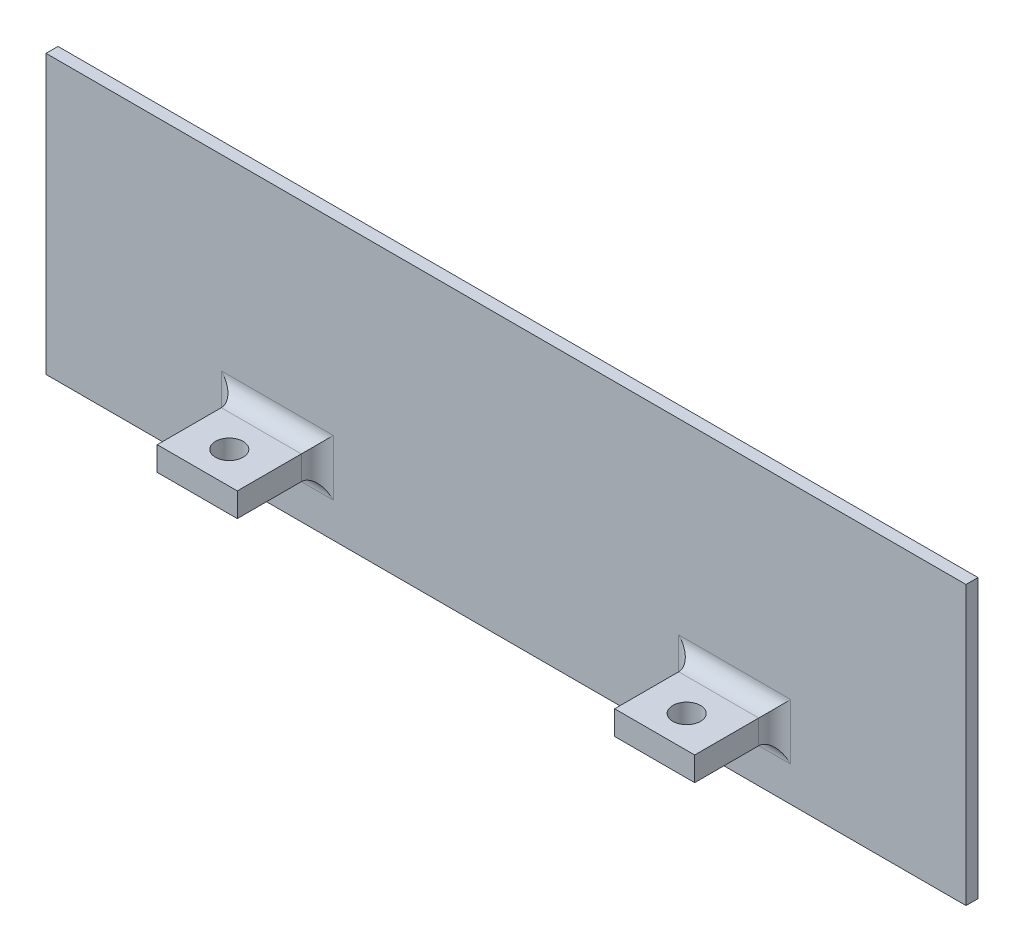
ISO-10303-21;
HEADER;
FILE_DESCRIPTION(('STEP AP214'),'2;1');
FILE_NAME('part.step','',(''),(''),'','','');
FILE_SCHEMA(('AUTOMOTIVE_DESIGN { 1 0 10303 214 1 1 1 1 }'));
ENDSEC;
DATA;
#1=APPLICATION_CONTEXT('core data for automotive mechanical design processes');
#2=APPLICATION_PROTOCOL_DEFINITION('international standard','automotive_design',2000,#1);
#3=PRODUCT_CONTEXT('',#1,'mechanical');
#4=PRODUCT('Part','Part','',(#3));
#5=PRODUCT_RELATED_PRODUCT_CATEGORY('part','',(#4));
#6=PRODUCT_DEFINITION_FORMATION('','',#4);
#7=PRODUCT_DEFINITION_CONTEXT('part definition',#1,'design');
#8=PRODUCT_DEFINITION('design','',#6,#7);
#9=PRODUCT_DEFINITION_SHAPE('','',#8);
#10=(LENGTH_UNIT() NAMED_UNIT(*) SI_UNIT(.MILLI.,.METRE.));
#11=(NAMED_UNIT(*) PLANE_ANGLE_UNIT() SI_UNIT($,.RADIAN.));
#12=(NAMED_UNIT(*) SI_UNIT($,.STERADIAN.) SOLID_ANGLE_UNIT());
#13=UNCERTAINTY_MEASURE_WITH_UNIT(LENGTH_MEASURE(1.E-05),#10,'distance_accuracy_value','');
#14=(GEOMETRIC_REPRESENTATION_CONTEXT(3) GLOBAL_UNCERTAINTY_ASSIGNED_CONTEXT((#13)) GLOBAL_UNIT_ASSIGNED_CONTEXT((#10,
#11,#12)) REPRESENTATION_CONTEXT('',''));
#15=CARTESIAN_POINT('',(0.,0.,0.));
#16=DIRECTION('',(0.,0.,1.));
#17=DIRECTION('',(1.,0.,0.));
#18=AXIS2_PLACEMENT_3D('',#15,#16,#17);
#19=CARTESIAN_POINT('',(0.,0.,1.5));
#20=DIRECTION('',(0.,0.,-1.));
#21=DIRECTION('',(-1.,0.,0.));
#22=AXIS2_PLACEMENT_3D('',#19,#20,#21);
#23=PLANE('',#22);
#24=DIRECTION('',(1.,0.,0.));
#25=VECTOR('',#24,1.);
#26=CARTESIAN_POINT('',(23.575,-8.64111728192778,1.5));
#27=LINE('',#26,#25);
#28=CARTESIAN_POINT('',(35.575,-8.64111728192778,1.5));
#29=VERTEX_POINT('',#28);
#30=CARTESIAN_POINT('',(21.575,-8.64111728192778,1.5));
#31=VERTEX_POINT('',#30);
#32=EDGE_CURVE('E244',#29,#31,#27,.F.);
#33=ORIENTED_EDGE('',*,*,#32,.T.);
#34=DIRECTION('',(0.,-1.,0.));
#35=VECTOR('',#34,1.);
#36=CARTESIAN_POINT('',(21.575,-3.64111728192778,1.5));
#37=LINE('',#36,#35);
#38=CARTESIAN_POINT('',(21.575,-1.64111728192778,1.5));
#39=VERTEX_POINT('',#38);
#40=EDGE_CURVE('E250',#31,#39,#37,.F.);
#41=ORIENTED_EDGE('',*,*,#40,.T.);
#42=DIRECTION('',(-1.,0.,0.));
#43=VECTOR('',#42,1.);
#44=CARTESIAN_POINT('',(33.575,-1.64111728192778,1.5));
#45=LINE('',#44,#43);
#46=CARTESIAN_POINT('',(35.575,-1.64111728192778,1.5));
#47=VERTEX_POINT('',#46);
#48=EDGE_CURVE('E248',#39,#47,#45,.F.);
#49=ORIENTED_EDGE('',*,*,#48,.T.);
#50=DIRECTION('',(0.,1.,0.));
#51=VECTOR('',#50,1.);
#52=CARTESIAN_POINT('',(35.575,-6.64111728192778,1.5));
#53=LINE('',#52,#51);
#54=EDGE_CURVE('E246',#47,#29,#53,.F.);
#55=ORIENTED_EDGE('',*,*,#54,.T.);
#56=EDGE_LOOP('',(#33,#41,#49,#55));
#57=FACE_BOUND('',#56,.T.);
#58=DIRECTION('',(-1.,0.,0.));
#59=VECTOR('',#58,1.);
#60=CARTESIAN_POINT('',(-23.575,-1.64111728192778,1.5));
#61=LINE('',#60,#59);
#62=CARTESIAN_POINT('',(-35.575,-1.64111728192778,1.5));
#63=VERTEX_POINT('',#62);
#64=CARTESIAN_POINT('',(-21.575,-1.64111728192778,1.5));
#65=VERTEX_POINT('',#64);
#66=EDGE_CURVE('E239',#63,#65,#61,.F.);
#67=ORIENTED_EDGE('',*,*,#66,.T.);
#68=DIRECTION('',(0.,1.,0.));
#69=VECTOR('',#68,1.);
#70=CARTESIAN_POINT('',(-21.575,-6.64111728192778,1.5));
#71=LINE('',#70,#69);
#72=CARTESIAN_POINT('',(-21.575,-8.64111728192778,1.5));
#73=VERTEX_POINT('',#72);
#74=EDGE_CURVE('E241',#65,#73,#71,.F.);
#75=ORIENTED_EDGE('',*,*,#74,.T.);
#76=DIRECTION('',(1.,0.,0.));
#77=VECTOR('',#76,1.);
#78=CARTESIAN_POINT('',(-33.575,-8.64111728192778,1.5));
#79=LINE('',#78,#77);
#80=CARTESIAN_POINT('',(-35.575,-8.64111728192778,1.5));
#81=VERTEX_POINT('',#80);
#82=EDGE_CURVE('E235',#73,#81,#79,.F.);
#83=ORIENTED_EDGE('',*,*,#82,.T.);
#84=DIRECTION('',(0.,-1.,0.));
#85=VECTOR('',#84,1.);
#86=CARTESIAN_POINT('',(-35.575,-3.64111728192778,1.5));
#87=LINE('',#86,#85);
#88=EDGE_CURVE('E237',#81,#63,#87,.F.);
#89=ORIENTED_EDGE('',*,*,#88,.T.);
#90=EDGE_LOOP('',(#67,#75,#83,#89));
#91=FACE_BOUND('',#90,.T.);
#92=DIRECTION('',(0.,1.,0.));
#93=VECTOR('',#92,1.);
#94=CARTESIAN_POINT('',(57.4750000000003,-12.9911172819278,1.5));
#95=LINE('',#94,#93);
#96=CARTESIAN_POINT('',(57.4750000000003,-12.9911172819278,1.5));
#97=VERTEX_POINT('',#96);
#98=CARTESIAN_POINT('',(57.4749999999997,21.7588827180722,1.5));
#99=VERTEX_POINT('',#98);
#100=EDGE_CURVE('E203',#97,#99,#95,.T.);
#101=ORIENTED_EDGE('',*,*,#100,.T.);
#102=DIRECTION('',(-1.,0.,0.));
#103=VECTOR('',#102,1.);
#104=CARTESIAN_POINT('',(-57.4750000000003,21.7588827180722,1.5));
#105=LINE('',#104,#103);
#106=CARTESIAN_POINT('',(-57.4750000000003,21.7588827180722,1.5));
#107=VERTEX_POINT('',#106);
#108=EDGE_CURVE('E206',#99,#107,#105,.T.);
#109=ORIENTED_EDGE('',*,*,#108,.T.);
#110=DIRECTION('',(0.,-1.,0.));
#111=VECTOR('',#110,1.);
#112=CARTESIAN_POINT('',(-57.4750000000003,-12.9911172819278,1.5));
#113=LINE('',#112,#111);
#114=CARTESIAN_POINT('',(-57.4750000000003,-12.9911172819278,1.5));
#115=VERTEX_POINT('',#114);
#116=EDGE_CURVE('E209',#107,#115,#113,.T.);
#117=ORIENTED_EDGE('',*,*,#116,.T.);
#118=DIRECTION('',(1.,0.,0.));
#119=VECTOR('',#118,1.);
#120=CARTESIAN_POINT('',(-57.4750000000003,-12.9911172819278,1.5));
#121=LINE('',#120,#119);
#122=EDGE_CURVE('E211',#115,#97,#121,.T.);
#123=ORIENTED_EDGE('',*,*,#122,.T.);
#124=EDGE_LOOP('',(#101,#109,#117,#123));
#125=FACE_BOUND('',#124,.T.);
#126=ADVANCED_FACE('F37',(#57,#91,#125),#23,.F.);
#127=CARTESIAN_POINT('',(57.4750000000003,-12.9911172819278,1.5));
#128=DIRECTION('',(-1.,0.,0.));
#129=DIRECTION('',(0.,-1.,0.));
#130=AXIS2_PLACEMENT_3D('',#127,#128,#129);
#131=PLANE('',#130);
#132=DIRECTION('',(0.,1.,0.));
#133=VECTOR('',#132,1.);
#134=CARTESIAN_POINT('',(57.4750000000003,-12.9911172819278,0.));
#135=LINE('',#134,#133);
#136=CARTESIAN_POINT('',(57.4750000000003,-12.9911172819278,0.));
#137=VERTEX_POINT('',#136);
#138=CARTESIAN_POINT('',(57.4749999999997,21.7588827180722,0.));
#139=VERTEX_POINT('',#138);
#140=EDGE_CURVE('E202',#137,#139,#135,.T.);
#141=ORIENTED_EDGE('',*,*,#140,.T.);
#142=DIRECTION('',(0.,0.,-1.));
#143=VECTOR('',#142,1.);
#144=CARTESIAN_POINT('',(57.4749999999997,21.7588827180722,1.5));
#145=LINE('',#144,#143);
#146=EDGE_CURVE('E229',#99,#139,#145,.T.);
#147=ORIENTED_EDGE('',*,*,#146,.F.);
#148=ORIENTED_EDGE('',*,*,#100,.F.);
#149=DIRECTION('',(0.,0.,-1.));
#150=VECTOR('',#149,1.);
#151=CARTESIAN_POINT('',(57.4750000000003,-12.9911172819278,1.5));
#152=LINE('',#151,#150);
#153=EDGE_CURVE('E213',#97,#137,#152,.T.);
#154=ORIENTED_EDGE('',*,*,#153,.T.);
#155=EDGE_LOOP('',(#141,#147,#148,#154));
#156=FACE_BOUND('',#155,.T.);
#157=ADVANCED_FACE('F317',(#156),#131,.F.);
#158=CARTESIAN_POINT('',(-57.4750000000003,21.7588827180722,1.5));
#159=DIRECTION('',(0.,-1.,0.));
#160=DIRECTION('',(0.,0.,-1.));
#161=AXIS2_PLACEMENT_3D('',#158,#159,#160);
#162=PLANE('',#161);
#163=DIRECTION('',(-1.,0.,0.));
#164=VECTOR('',#163,1.);
#165=CARTESIAN_POINT('',(-57.4750000000003,21.7588827180722,0.));
#166=LINE('',#165,#164);
#167=CARTESIAN_POINT('',(-57.4750000000003,21.7588827180722,0.));
#168=VERTEX_POINT('',#167);
#169=EDGE_CURVE('E216',#139,#168,#166,.T.);
#170=ORIENTED_EDGE('',*,*,#169,.T.);
#171=DIRECTION('',(0.,0.,-1.));
#172=VECTOR('',#171,1.);
#173=CARTESIAN_POINT('',(-57.4750000000003,21.7588827180722,1.5));
#174=LINE('',#173,#172);
#175=EDGE_CURVE('E226',#107,#168,#174,.T.);
#176=ORIENTED_EDGE('',*,*,#175,.F.);
#177=ORIENTED_EDGE('',*,*,#108,.F.);
#178=ORIENTED_EDGE('',*,*,#146,.T.);
#179=EDGE_LOOP('',(#170,#176,#177,#178));
#180=FACE_BOUND('',#179,.T.);
#181=ADVANCED_FACE('F322',(#180),#162,.F.);
#182=CARTESIAN_POINT('',(-57.4750000000003,-12.9911172819278,1.5));
#183=DIRECTION('',(1.,0.,0.));
#184=DIRECTION('',(0.,0.,-1.));
#185=AXIS2_PLACEMENT_3D('',#182,#183,#184);
#186=PLANE('',#185);
#187=DIRECTION('',(0.,-1.,0.));
#188=VECTOR('',#187,1.);
#189=CARTESIAN_POINT('',(-57.4750000000003,-12.9911172819278,0.));
#190=LINE('',#189,#188);
#191=CARTESIAN_POINT('',(-57.4750000000003,-12.9911172819278,0.));
#192=VERTEX_POINT('',#191);
#193=EDGE_CURVE('E218',#168,#192,#190,.T.);
#194=ORIENTED_EDGE('',*,*,#193,.T.);
#195=DIRECTION('',(0.,0.,-1.));
#196=VECTOR('',#195,1.);
#197=CARTESIAN_POINT('',(-57.4750000000003,-12.9911172819278,1.5));
#198=LINE('',#197,#196);
#199=EDGE_CURVE('E223',#115,#192,#198,.T.);
#200=ORIENTED_EDGE('',*,*,#199,.F.);
#201=ORIENTED_EDGE('',*,*,#116,.F.);
#202=ORIENTED_EDGE('',*,*,#175,.T.);
#203=EDGE_LOOP('',(#194,#200,#201,#202));
#204=FACE_BOUND('',#203,.T.);
#205=ADVANCED_FACE('F336',(#204),#186,.F.);
#206=CARTESIAN_POINT('',(-57.4750000000003,-12.9911172819278,1.5));
#207=DIRECTION('',(0.,1.,0.));
#208=DIRECTION('',(0.,0.,1.));
#209=AXIS2_PLACEMENT_3D('',#206,#207,#208);
#210=PLANE('',#209);
#211=DIRECTION('',(1.,0.,0.));
#212=VECTOR('',#211,1.);
#213=CARTESIAN_POINT('',(-57.4750000000003,-12.9911172819278,0.));
#214=LINE('',#213,#212);
#215=EDGE_CURVE('E207',#192,#137,#214,.T.);
#216=ORIENTED_EDGE('',*,*,#215,.T.);
#217=ORIENTED_EDGE('',*,*,#153,.F.);
#218=ORIENTED_EDGE('',*,*,#122,.F.);
#219=ORIENTED_EDGE('',*,*,#199,.T.);
#220=EDGE_LOOP('',(#216,#217,#218,#219));
#221=FACE_BOUND('',#220,.T.);
#222=ADVANCED_FACE('F332',(#221),#210,.F.);
#223=CARTESIAN_POINT('',(0.,0.,0.));
#224=DIRECTION('',(0.,0.,-1.));
#225=DIRECTION('',(-1.,0.,0.));
#226=AXIS2_PLACEMENT_3D('',#223,#224,#225);
#227=PLANE('',#226);
#228=ORIENTED_EDGE('',*,*,#140,.F.);
#229=ORIENTED_EDGE('',*,*,#215,.F.);
#230=ORIENTED_EDGE('',*,*,#193,.F.);
#231=ORIENTED_EDGE('',*,*,#169,.F.);
#232=EDGE_LOOP('',(#228,#229,#230,#231));
#233=FACE_BOUND('',#232,.T.);
#234=ADVANCED_FACE('F329',(#233),#227,.T.);
#235=CARTESIAN_POINT('',(-33.575,-3.64111728192778,11.5));
#236=DIRECTION('',(1.,0.,0.));
#237=DIRECTION('',(0.,0.,-1.));
#238=AXIS2_PLACEMENT_3D('',#235,#236,#237);
#239=PLANE('',#238);
#240=DIRECTION('',(0.,0.,-1.));
#241=VECTOR('',#240,1.);
#242=CARTESIAN_POINT('',(-33.575,-3.64111728192778,11.5));
#243=LINE('',#242,#241);
#244=CARTESIAN_POINT('',(-33.575,-3.64111728192778,11.5));
#245=VERTEX_POINT('',#244);
#246=CARTESIAN_POINT('',(-33.575,-3.64111728192778,3.5));
#247=VERTEX_POINT('',#246);
#248=EDGE_CURVE('E192',#245,#247,#243,.T.);
#249=ORIENTED_EDGE('',*,*,#248,.T.);
#250=DIRECTION('',(0.,-1.,0.));
#251=VECTOR('',#250,1.);
#252=CARTESIAN_POINT('',(-33.575,-6.64111728192778,3.5));
#253=LINE('',#252,#251);
#254=CARTESIAN_POINT('',(-33.575,-6.64111728192778,3.5));
#255=VERTEX_POINT('',#254);
#256=EDGE_CURVE('E46',#247,#255,#253,.T.);
#257=ORIENTED_EDGE('',*,*,#256,.T.);
#258=DIRECTION('',(0.,0.,-1.));
#259=VECTOR('',#258,1.);
#260=CARTESIAN_POINT('',(-33.575,-6.64111728192778,11.5));
#261=LINE('',#260,#259);
#262=CARTESIAN_POINT('',(-33.575,-6.64111728192778,11.5));
#263=VERTEX_POINT('',#262);
#264=EDGE_CURVE('E200',#263,#255,#261,.T.);
#265=ORIENTED_EDGE('',*,*,#264,.F.);
#266=DIRECTION('',(0.,-1.,0.));
#267=VECTOR('',#266,1.);
#268=CARTESIAN_POINT('',(-33.575,-3.64111728192778,11.5));
#269=LINE('',#268,#267);
#270=EDGE_CURVE('E178',#245,#263,#269,.T.);
#271=ORIENTED_EDGE('',*,*,#270,.F.);
#272=EDGE_LOOP('',(#249,#257,#265,#271));
#273=FACE_BOUND('',#272,.T.);
#274=ADVANCED_FACE('F327',(#273),#239,.F.);
#275=CARTESIAN_POINT('',(-33.575,-6.64111728192778,11.5));
#276=DIRECTION('',(0.,1.,0.));
#277=DIRECTION('',(0.,0.,1.));
#278=AXIS2_PLACEMENT_3D('',#275,#276,#277);
#279=PLANE('',#278);
#280=CARTESIAN_POINT('',(-28.575,-6.64111728192778,7.5));
#281=DIRECTION('',(0.,1.,0.));
#282=DIRECTION('',(0.,0.,1.));
#283=AXIS2_PLACEMENT_3D('',#280,#281,#282);
#284=CIRCLE('',#283,1.7272);
#285=CARTESIAN_POINT('',(-28.575,-6.64111728192778,9.2272));
#286=VERTEX_POINT('',#285);
#287=EDGE_CURVE('E629',#286,#286,#284,.T.);
#288=ORIENTED_EDGE('',*,*,#287,.T.);
#289=EDGE_LOOP('',(#288));
#290=FACE_BOUND('',#289,.T.);
#291=ORIENTED_EDGE('',*,*,#264,.T.);
#292=DIRECTION('',(1.,0.,0.));
#293=VECTOR('',#292,1.);
#294=CARTESIAN_POINT('',(-23.575,-6.64111728192778,3.5));
#295=LINE('',#294,#293);
#296=CARTESIAN_POINT('',(-23.575,-6.64111728192778,3.5));
#297=VERTEX_POINT('',#296);
#298=EDGE_CURVE('E11',#255,#297,#295,.T.);
#299=ORIENTED_EDGE('',*,*,#298,.T.);
#300=DIRECTION('',(0.,0.,-1.));
#301=VECTOR('',#300,1.);
#302=CARTESIAN_POINT('',(-23.575,-6.64111728192778,11.5));
#303=LINE('',#302,#301);
#304=CARTESIAN_POINT('',(-23.575,-6.64111728192778,11.5));
#305=VERTEX_POINT('',#304);
#306=EDGE_CURVE('E197',#305,#297,#303,.T.);
#307=ORIENTED_EDGE('',*,*,#306,.F.);
#308=DIRECTION('',(1.,0.,0.));
#309=VECTOR('',#308,1.);
#310=CARTESIAN_POINT('',(-33.575,-6.64111728192778,11.5));
#311=LINE('',#310,#309);
#312=EDGE_CURVE('E182',#263,#305,#311,.T.);
#313=ORIENTED_EDGE('',*,*,#312,.F.);
#314=EDGE_LOOP('',(#291,#299,#307,#313));
#315=FACE_BOUND('',#314,.T.);
#316=ADVANCED_FACE('F512',(#290,#315),#279,.F.);
#317=CARTESIAN_POINT('',(-23.575,-3.64111728192778,11.5));
#318=DIRECTION('',(-1.,0.,0.));
#319=DIRECTION('',(0.,0.,1.));
#320=AXIS2_PLACEMENT_3D('',#317,#318,#319);
#321=PLANE('',#320);
#322=ORIENTED_EDGE('',*,*,#306,.T.);
#323=DIRECTION('',(0.,1.,0.));
#324=VECTOR('',#323,1.);
#325=CARTESIAN_POINT('',(-23.575,-3.64111728192778,3.5));
#326=LINE('',#325,#324);
#327=CARTESIAN_POINT('',(-23.575,-3.64111728192778,3.5));
#328=VERTEX_POINT('',#327);
#329=EDGE_CURVE('E232',#297,#328,#326,.T.);
#330=ORIENTED_EDGE('',*,*,#329,.T.);
#331=DIRECTION('',(0.,0.,-1.));
#332=VECTOR('',#331,1.);
#333=CARTESIAN_POINT('',(-23.575,-3.64111728192778,11.5));
#334=LINE('',#333,#332);
#335=CARTESIAN_POINT('',(-23.575,-3.64111728192778,11.5));
#336=VERTEX_POINT('',#335);
#337=EDGE_CURVE('E194',#336,#328,#334,.T.);
#338=ORIENTED_EDGE('',*,*,#337,.F.);
#339=DIRECTION('',(0.,1.,0.));
#340=VECTOR('',#339,1.);
#341=CARTESIAN_POINT('',(-23.575,-3.64111728192778,11.5));
#342=LINE('',#341,#340);
#343=EDGE_CURVE('E188',#305,#336,#342,.T.);
#344=ORIENTED_EDGE('',*,*,#343,.F.);
#345=EDGE_LOOP('',(#322,#330,#338,#344));
#346=FACE_BOUND('',#345,.T.);
#347=ADVANCED_FACE('F503',(#346),#321,.F.);
#348=CARTESIAN_POINT('',(-33.575,-3.64111728192778,11.5));
#349=DIRECTION('',(0.,-1.,0.));
#350=DIRECTION('',(0.,0.,-1.));
#351=AXIS2_PLACEMENT_3D('',#348,#349,#350);
#352=PLANE('',#351);
#353=CARTESIAN_POINT('',(-28.575,-3.64111728192778,7.5));
#354=DIRECTION('',(0.,1.,0.));
#355=DIRECTION('',(0.,0.,1.));
#356=AXIS2_PLACEMENT_3D('',#353,#354,#355);
#357=CIRCLE('',#356,1.7272);
#358=CARTESIAN_POINT('',(-28.575,-3.64111728192778,9.2272));
#359=VERTEX_POINT('',#358);
#360=EDGE_CURVE('E632',#359,#359,#357,.T.);
#361=ORIENTED_EDGE('',*,*,#360,.F.);
#362=EDGE_LOOP('',(#361));
#363=FACE_BOUND('',#362,.T.);
#364=ORIENTED_EDGE('',*,*,#337,.T.);
#365=DIRECTION('',(-1.,0.,0.));
#366=VECTOR('',#365,1.);
#367=CARTESIAN_POINT('',(-33.575,-3.64111728192778,3.5));
#368=LINE('',#367,#366);
#369=EDGE_CURVE('E253',#328,#247,#368,.T.);
#370=ORIENTED_EDGE('',*,*,#369,.T.);
#371=ORIENTED_EDGE('',*,*,#248,.F.);
#372=DIRECTION('',(-1.,0.,0.));
#373=VECTOR('',#372,1.);
#374=CARTESIAN_POINT('',(-33.575,-3.64111728192778,11.5));
#375=LINE('',#374,#373);
#376=EDGE_CURVE('E190',#336,#245,#375,.T.);
#377=ORIENTED_EDGE('',*,*,#376,.F.);
#378=EDGE_LOOP('',(#364,#370,#371,#377));
#379=FACE_BOUND('',#378,.T.);
#380=ADVANCED_FACE('F494',(#363,#379),#352,.F.);
#381=CARTESIAN_POINT('',(0.,0.,11.5));
#382=DIRECTION('',(0.,0.,1.));
#383=DIRECTION('',(1.,0.,0.));
#384=AXIS2_PLACEMENT_3D('',#381,#382,#383);
#385=PLANE('',#384);
#386=ORIENTED_EDGE('',*,*,#270,.T.);
#387=ORIENTED_EDGE('',*,*,#312,.T.);
#388=ORIENTED_EDGE('',*,*,#343,.T.);
#389=ORIENTED_EDGE('',*,*,#376,.T.);
#390=EDGE_LOOP('',(#386,#387,#388,#389));
#391=FACE_BOUND('',#390,.T.);
#392=ADVANCED_FACE('F485',(#391),#385,.T.);
#393=CARTESIAN_POINT('',(23.575,-3.64111728192778,11.5));
#394=DIRECTION('',(1.,0.,0.));
#395=DIRECTION('',(0.,1.,0.));
#396=AXIS2_PLACEMENT_3D('',#393,#394,#395);
#397=PLANE('',#396);
#398=DIRECTION('',(0.,0.,-1.));
#399=VECTOR('',#398,1.);
#400=CARTESIAN_POINT('',(23.575,-3.64111728192778,11.5));
#401=LINE('',#400,#399);
#402=CARTESIAN_POINT('',(23.575,-3.64111728192778,11.5));
#403=VERTEX_POINT('',#402);
#404=CARTESIAN_POINT('',(23.575,-3.64111728192778,3.5));
#405=VERTEX_POINT('',#404);
#406=EDGE_CURVE('E165',#403,#405,#401,.T.);
#407=ORIENTED_EDGE('',*,*,#406,.T.);
#408=DIRECTION('',(0.,-1.,0.));
#409=VECTOR('',#408,1.);
#410=CARTESIAN_POINT('',(23.575,-6.64111728192778,3.5));
#411=LINE('',#410,#409);
#412=CARTESIAN_POINT('',(23.575,-6.64111728192778,3.5));
#413=VERTEX_POINT('',#412);
#414=EDGE_CURVE('E255',#405,#413,#411,.T.);
#415=ORIENTED_EDGE('',*,*,#414,.T.);
#416=DIRECTION('',(0.,0.,-1.));
#417=VECTOR('',#416,1.);
#418=CARTESIAN_POINT('',(23.575,-6.64111728192778,11.5));
#419=LINE('',#418,#417);
#420=CARTESIAN_POINT('',(23.575,-6.64111728192778,11.5));
#421=VERTEX_POINT('',#420);
#422=EDGE_CURVE('E177',#421,#413,#419,.T.);
#423=ORIENTED_EDGE('',*,*,#422,.F.);
#424=DIRECTION('',(0.,-1.,0.));
#425=VECTOR('',#424,1.);
#426=CARTESIAN_POINT('',(23.575,-3.64111728192778,11.5));
#427=LINE('',#426,#425);
#428=EDGE_CURVE('E158',#403,#421,#427,.T.);
#429=ORIENTED_EDGE('',*,*,#428,.F.);
#430=EDGE_LOOP('',(#407,#415,#423,#429));
#431=FACE_BOUND('',#430,.T.);
#432=ADVANCED_FACE('F176',(#431),#397,.F.);
#433=CARTESIAN_POINT('',(23.575,-6.64111728192778,11.5));
#434=DIRECTION('',(0.,1.,0.));
#435=DIRECTION('',(0.,0.,1.));
#436=AXIS2_PLACEMENT_3D('',#433,#434,#435);
#437=PLANE('',#436);
#438=CARTESIAN_POINT('',(28.575,-6.64111728192778,7.5));
#439=DIRECTION('',(0.,1.,0.));
#440=DIRECTION('',(0.,0.,1.));
#441=AXIS2_PLACEMENT_3D('',#438,#439,#440);
#442=CIRCLE('',#441,1.7272);
#443=CARTESIAN_POINT('',(28.575,-6.64111728192778,9.2272));
#444=VERTEX_POINT('',#443);
#445=EDGE_CURVE('E275',#444,#444,#442,.T.);
#446=ORIENTED_EDGE('',*,*,#445,.T.);
#447=EDGE_LOOP('',(#446));
#448=FACE_BOUND('',#447,.T.);
#449=ORIENTED_EDGE('',*,*,#422,.T.);
#450=DIRECTION('',(1.,0.,0.));
#451=VECTOR('',#450,1.);
#452=CARTESIAN_POINT('',(33.575,-6.64111728192778,3.5));
#453=LINE('',#452,#451);
#454=CARTESIAN_POINT('',(33.575,-6.64111728192778,3.5));
#455=VERTEX_POINT('',#454);
#456=EDGE_CURVE('E61',#413,#455,#453,.T.);
#457=ORIENTED_EDGE('',*,*,#456,.T.);
#458=DIRECTION('',(0.,0.,-1.));
#459=VECTOR('',#458,1.);
#460=CARTESIAN_POINT('',(33.575,-6.64111728192778,11.5));
#461=LINE('',#460,#459);
#462=CARTESIAN_POINT('',(33.575,-6.64111728192778,11.5));
#463=VERTEX_POINT('',#462);
#464=EDGE_CURVE('E298',#463,#455,#461,.T.);
#465=ORIENTED_EDGE('',*,*,#464,.F.);
#466=DIRECTION('',(1.,0.,0.));
#467=VECTOR('',#466,1.);
#468=CARTESIAN_POINT('',(23.575,-6.64111728192778,11.5));
#469=LINE('',#468,#467);
#470=EDGE_CURVE('E179',#421,#463,#469,.T.);
#471=ORIENTED_EDGE('',*,*,#470,.F.);
#472=EDGE_LOOP('',(#449,#457,#465,#471));
#473=FACE_BOUND('',#472,.T.);
#474=ADVANCED_FACE('F297',(#448,#473),#437,.F.);
#475=CARTESIAN_POINT('',(33.575,-3.64111728192778,11.5));
#476=DIRECTION('',(-1.,0.,0.));
#477=DIRECTION('',(0.,0.,1.));
#478=AXIS2_PLACEMENT_3D('',#475,#476,#477);
#479=PLANE('',#478);
#480=ORIENTED_EDGE('',*,*,#464,.T.);
#481=DIRECTION('',(0.,1.,0.));
#482=VECTOR('',#481,1.);
#483=CARTESIAN_POINT('',(33.575,-3.64111728192778,3.5));
#484=LINE('',#483,#482);
#485=CARTESIAN_POINT('',(33.575,-3.64111728192778,3.5));
#486=VERTEX_POINT('',#485);
#487=EDGE_CURVE('E258',#455,#486,#484,.T.);
#488=ORIENTED_EDGE('',*,*,#487,.T.);
#489=DIRECTION('',(0.,0.,-1.));
#490=VECTOR('',#489,1.);
#491=CARTESIAN_POINT('',(33.575,-3.64111728192778,11.5));
#492=LINE('',#491,#490);
#493=CARTESIAN_POINT('',(33.575,-3.64111728192778,11.5));
#494=VERTEX_POINT('',#493);
#495=EDGE_CURVE('E174',#494,#486,#492,.T.);
#496=ORIENTED_EDGE('',*,*,#495,.F.);
#497=DIRECTION('',(0.,1.,0.));
#498=VECTOR('',#497,1.);
#499=CARTESIAN_POINT('',(33.575,-3.64111728192778,11.5));
#500=LINE('',#499,#498);
#501=EDGE_CURVE('E161',#463,#494,#500,.T.);
#502=ORIENTED_EDGE('',*,*,#501,.F.);
#503=EDGE_LOOP('',(#480,#488,#496,#502));
#504=FACE_BOUND('',#503,.T.);
#505=ADVANCED_FACE('F305',(#504),#479,.F.);
#506=CARTESIAN_POINT('',(23.575,-3.64111728192778,11.5));
#507=DIRECTION('',(0.,-1.,0.));
#508=DIRECTION('',(0.,0.,-1.));
#509=AXIS2_PLACEMENT_3D('',#506,#507,#508);
#510=PLANE('',#509);
#511=CARTESIAN_POINT('',(28.575,-3.64111728192778,7.5));
#512=DIRECTION('',(0.,1.,0.));
#513=DIRECTION('',(0.,0.,1.));
#514=AXIS2_PLACEMENT_3D('',#511,#512,#513);
#515=CIRCLE('',#514,1.7272);
#516=CARTESIAN_POINT('',(28.575,-3.64111728192778,9.2272));
#517=VERTEX_POINT('',#516);
#518=EDGE_CURVE('E631',#517,#517,#515,.T.);
#519=ORIENTED_EDGE('',*,*,#518,.F.);
#520=EDGE_LOOP('',(#519));
#521=FACE_BOUND('',#520,.T.);
#522=ORIENTED_EDGE('',*,*,#495,.T.);
#523=DIRECTION('',(-1.,0.,0.));
#524=VECTOR('',#523,1.);
#525=CARTESIAN_POINT('',(23.575,-3.64111728192778,3.5));
#526=LINE('',#525,#524);
#527=EDGE_CURVE('E170',#486,#405,#526,.T.);
#528=ORIENTED_EDGE('',*,*,#527,.T.);
#529=ORIENTED_EDGE('',*,*,#406,.F.);
#530=DIRECTION('',(-1.,0.,0.));
#531=VECTOR('',#530,1.);
#532=CARTESIAN_POINT('',(23.575,-3.64111728192778,11.5));
#533=LINE('',#532,#531);
#534=EDGE_CURVE('E154',#494,#403,#533,.T.);
#535=ORIENTED_EDGE('',*,*,#534,.F.);
#536=EDGE_LOOP('',(#522,#528,#529,#535));
#537=FACE_BOUND('',#536,.T.);
#538=ADVANCED_FACE('F168',(#521,#537),#510,.F.);
#539=CARTESIAN_POINT('',(0.,0.,11.5));
#540=DIRECTION('',(0.,0.,1.));
#541=DIRECTION('',(1.,0.,0.));
#542=AXIS2_PLACEMENT_3D('',#539,#540,#541);
#543=PLANE('',#542);
#544=ORIENTED_EDGE('',*,*,#428,.T.);
#545=ORIENTED_EDGE('',*,*,#470,.T.);
#546=ORIENTED_EDGE('',*,*,#501,.T.);
#547=ORIENTED_EDGE('',*,*,#534,.T.);
#548=EDGE_LOOP('',(#544,#545,#546,#547));
#549=FACE_BOUND('',#548,.T.);
#550=ADVANCED_FACE('F156',(#549),#543,.T.);
#551=CARTESIAN_POINT('',(-35.575,-3.64111728192778,3.5));
#552=DIRECTION('',(0.,1.,0.));
#553=DIRECTION('',(0.,0.,1.));
#554=AXIS2_PLACEMENT_3D('',#551,#552,#553);
#555=CYLINDRICAL_SURFACE('',#554,2.);
#556=CARTESIAN_POINT('',(-35.575,-1.64111728192778,3.5));
#557=DIRECTION('',(0.707106781186547,0.707106781186547,0.));
#558=DIRECTION('',(-0.707106781186547,0.707106781186547,0.));
#559=AXIS2_PLACEMENT_3D('',#556,#557,#558);
#560=ELLIPSE('',#559,2.82842712474619,2.);
#561=EDGE_CURVE('E266',#63,#247,#560,.F.);
#562=ORIENTED_EDGE('',*,*,#561,.F.);
#563=ORIENTED_EDGE('',*,*,#88,.F.);
#564=CARTESIAN_POINT('',(-35.575,-8.64111728192778,3.5));
#565=DIRECTION('',(-0.707106781186547,0.707106781186547,0.));
#566=DIRECTION('',(-0.707106781186547,-0.707106781186547,0.));
#567=AXIS2_PLACEMENT_3D('',#564,#565,#566);
#568=ELLIPSE('',#567,2.82842712474619,2.);
#569=EDGE_CURVE('E269',#255,#81,#568,.T.);
#570=ORIENTED_EDGE('',*,*,#569,.F.);
#571=ORIENTED_EDGE('',*,*,#256,.F.);
#572=EDGE_LOOP('',(#562,#563,#570,#571));
#573=FACE_BOUND('',#572,.T.);
#574=ADVANCED_FACE('F355',(#573),#555,.F.);
#575=CARTESIAN_POINT('',(-33.575,-8.64111728192778,3.5));
#576=DIRECTION('',(-1.,0.,0.));
#577=DIRECTION('',(0.,0.,1.));
#578=AXIS2_PLACEMENT_3D('',#575,#576,#577);
#579=CYLINDRICAL_SURFACE('',#578,2.);
#580=ORIENTED_EDGE('',*,*,#569,.T.);
#581=ORIENTED_EDGE('',*,*,#82,.F.);
#582=CARTESIAN_POINT('',(-21.575,-8.64111728192778,3.5));
#583=DIRECTION('',(-0.707106781186547,-0.707106781186547,0.));
#584=DIRECTION('',(-0.707106781186547,0.707106781186547,0.));
#585=AXIS2_PLACEMENT_3D('',#582,#583,#584);
#586=ELLIPSE('',#585,2.82842712474619,2.);
#587=EDGE_CURVE('E264',#297,#73,#586,.T.);
#588=ORIENTED_EDGE('',*,*,#587,.F.);
#589=ORIENTED_EDGE('',*,*,#298,.F.);
#590=EDGE_LOOP('',(#580,#581,#588,#589));
#591=FACE_BOUND('',#590,.T.);
#592=ADVANCED_FACE('F351',(#591),#579,.F.);
#593=CARTESIAN_POINT('',(-33.575,-1.64111728192778,3.5));
#594=DIRECTION('',(1.,0.,0.));
#595=DIRECTION('',(0.,0.,-1.));
#596=AXIS2_PLACEMENT_3D('',#593,#594,#595);
#597=CYLINDRICAL_SURFACE('',#596,2.);
#598=ORIENTED_EDGE('',*,*,#561,.T.);
#599=ORIENTED_EDGE('',*,*,#369,.F.);
#600=CARTESIAN_POINT('',(-21.575,-1.64111728192778,3.5));
#601=DIRECTION('',(0.707106781186547,-0.707106781186547,0.));
#602=DIRECTION('',(0.707106781186547,0.707106781186547,0.));
#603=AXIS2_PLACEMENT_3D('',#600,#601,#602);
#604=ELLIPSE('',#603,2.82842712474619,2.);
#605=EDGE_CURVE('E262',#65,#328,#604,.F.);
#606=ORIENTED_EDGE('',*,*,#605,.F.);
#607=ORIENTED_EDGE('',*,*,#66,.F.);
#608=EDGE_LOOP('',(#598,#599,#606,#607));
#609=FACE_BOUND('',#608,.T.);
#610=ADVANCED_FACE('F347',(#609),#597,.F.);
#611=CARTESIAN_POINT('',(-21.575,-3.64111728192778,3.5));
#612=DIRECTION('',(0.,-1.,0.));
#613=DIRECTION('',(0.,0.,-1.));
#614=AXIS2_PLACEMENT_3D('',#611,#612,#613);
#615=CYLINDRICAL_SURFACE('',#614,2.);
#616=ORIENTED_EDGE('',*,*,#587,.T.);
#617=ORIENTED_EDGE('',*,*,#74,.F.);
#618=ORIENTED_EDGE('',*,*,#605,.T.);
#619=ORIENTED_EDGE('',*,*,#329,.F.);
#620=EDGE_LOOP('',(#616,#617,#618,#619));
#621=FACE_BOUND('',#620,.T.);
#622=ADVANCED_FACE('F344',(#621),#615,.F.);
#623=CARTESIAN_POINT('',(35.575,-3.64111728192778,3.5));
#624=DIRECTION('',(0.,-1.,0.));
#625=DIRECTION('',(0.,0.,-1.));
#626=AXIS2_PLACEMENT_3D('',#623,#624,#625);
#627=CYLINDRICAL_SURFACE('',#626,2.);
#628=CARTESIAN_POINT('',(35.575,-8.64111728192778,3.5));
#629=DIRECTION('',(-0.707106781186547,-0.707106781186547,0.));
#630=DIRECTION('',(-0.707106781186547,0.707106781186547,0.));
#631=AXIS2_PLACEMENT_3D('',#628,#629,#630);
#632=ELLIPSE('',#631,2.82842712474619,2.);
#633=EDGE_CURVE('E276',#29,#455,#632,.F.);
#634=ORIENTED_EDGE('',*,*,#633,.F.);
#635=ORIENTED_EDGE('',*,*,#54,.F.);
#636=CARTESIAN_POINT('',(35.575,-1.64111728192778,3.5));
#637=DIRECTION('',(0.707106781186547,-0.707106781186547,0.));
#638=DIRECTION('',(-0.707106781186547,-0.707106781186547,0.));
#639=AXIS2_PLACEMENT_3D('',#636,#637,#638);
#640=ELLIPSE('',#639,2.82842712474619,2.);
#641=EDGE_CURVE('E41',#486,#47,#640,.T.);
#642=ORIENTED_EDGE('',*,*,#641,.F.);
#643=ORIENTED_EDGE('',*,*,#487,.F.);
#644=EDGE_LOOP('',(#634,#635,#642,#643));
#645=FACE_BOUND('',#644,.T.);
#646=ADVANCED_FACE('F39',(#645),#627,.F.);
#647=CARTESIAN_POINT('',(23.575,-1.64111728192778,3.5));
#648=DIRECTION('',(1.,0.,0.));
#649=DIRECTION('',(0.,0.,-1.));
#650=AXIS2_PLACEMENT_3D('',#647,#648,#649);
#651=CYLINDRICAL_SURFACE('',#650,2.);
#652=ORIENTED_EDGE('',*,*,#641,.T.);
#653=ORIENTED_EDGE('',*,*,#48,.F.);
#654=CARTESIAN_POINT('',(21.575,-1.64111728192778,3.5));
#655=DIRECTION('',(0.707106781186547,0.707106781186548,0.));
#656=DIRECTION('',(0.707106781186548,-0.707106781186547,0.));
#657=AXIS2_PLACEMENT_3D('',#654,#655,#656);
#658=ELLIPSE('',#657,2.82842712474619,2.);
#659=EDGE_CURVE('E274',#405,#39,#658,.T.);
#660=ORIENTED_EDGE('',*,*,#659,.F.);
#661=ORIENTED_EDGE('',*,*,#527,.F.);
#662=EDGE_LOOP('',(#652,#653,#660,#661));
#663=FACE_BOUND('',#662,.T.);
#664=ADVANCED_FACE('F285',(#663),#651,.F.);
#665=CARTESIAN_POINT('',(23.575,-8.64111728192778,3.5));
#666=DIRECTION('',(-1.,0.,0.));
#667=DIRECTION('',(0.,0.,1.));
#668=AXIS2_PLACEMENT_3D('',#665,#666,#667);
#669=CYLINDRICAL_SURFACE('',#668,2.);
#670=ORIENTED_EDGE('',*,*,#633,.T.);
#671=ORIENTED_EDGE('',*,*,#456,.F.);
#672=CARTESIAN_POINT('',(21.575,-8.64111728192778,3.5));
#673=DIRECTION('',(-0.707106781186548,0.707106781186547,0.));
#674=DIRECTION('',(-0.707106781186547,-0.707106781186548,0.));
#675=AXIS2_PLACEMENT_3D('',#672,#673,#674);
#676=ELLIPSE('',#675,2.82842712474619,2.);
#677=EDGE_CURVE('E272',#31,#413,#676,.F.);
#678=ORIENTED_EDGE('',*,*,#677,.F.);
#679=ORIENTED_EDGE('',*,*,#32,.F.);
#680=EDGE_LOOP('',(#670,#671,#678,#679));
#681=FACE_BOUND('',#680,.T.);
#682=ADVANCED_FACE('F296',(#681),#669,.F.);
#683=CARTESIAN_POINT('',(21.575,-3.64111728192778,3.5));
#684=DIRECTION('',(0.,1.,0.));
#685=DIRECTION('',(-1.,0.,0.));
#686=AXIS2_PLACEMENT_3D('',#683,#684,#685);
#687=CYLINDRICAL_SURFACE('',#686,2.);
#688=ORIENTED_EDGE('',*,*,#659,.T.);
#689=ORIENTED_EDGE('',*,*,#40,.F.);
#690=ORIENTED_EDGE('',*,*,#677,.T.);
#691=ORIENTED_EDGE('',*,*,#414,.F.);
#692=EDGE_LOOP('',(#688,#689,#690,#691));
#693=FACE_BOUND('',#692,.T.);
#694=ADVANCED_FACE('F294',(#693),#687,.F.);
#695=CARTESIAN_POINT('',(28.575,-3.64111728192778,7.5));
#696=DIRECTION('',(0.,1.,0.));
#697=DIRECTION('',(0.,0.,1.));
#698=AXIS2_PLACEMENT_3D('',#695,#696,#697);
#699=CYLINDRICAL_SURFACE('',#698,1.7272);
#700=ORIENTED_EDGE('',*,*,#518,.T.);
#701=EDGE_LOOP('',(#700));
#702=FACE_BOUND('',#701,.T.);
#703=ORIENTED_EDGE('',*,*,#445,.F.);
#704=EDGE_LOOP('',(#703));
#705=FACE_BOUND('',#704,.T.);
#706=ADVANCED_FACE('F362',(#702,#705),#699,.F.);
#707=CARTESIAN_POINT('',(-28.575,-3.64111728192778,7.5));
#708=DIRECTION('',(0.,1.,0.));
#709=DIRECTION('',(0.,0.,1.));
#710=AXIS2_PLACEMENT_3D('',#707,#708,#709);
#711=CYLINDRICAL_SURFACE('',#710,1.7272);
#712=ORIENTED_EDGE('',*,*,#360,.T.);
#713=EDGE_LOOP('',(#712));
#714=FACE_BOUND('',#713,.T.);
#715=ORIENTED_EDGE('',*,*,#287,.F.);
#716=EDGE_LOOP('',(#715));
#717=FACE_BOUND('',#716,.T.);
#718=ADVANCED_FACE('F412',(#714,#717),#711,.F.);
#719=CLOSED_SHELL('',(#126,#157,#181,#205,#222,#234,#274,#316,#347,#380,#392,#432,#474,#505,
#538,#550,#574,#592,#610,#622,#646,#664,#682,#694,#706,#718));
#720=MANIFOLD_SOLID_BREP('B2',#719);
#721=ADVANCED_BREP_SHAPE_REPRESENTATION('',(#18,#720),#14);
#722=SHAPE_DEFINITION_REPRESENTATION(#9,#721);
ENDSEC;
END-ISO-10303-21;
